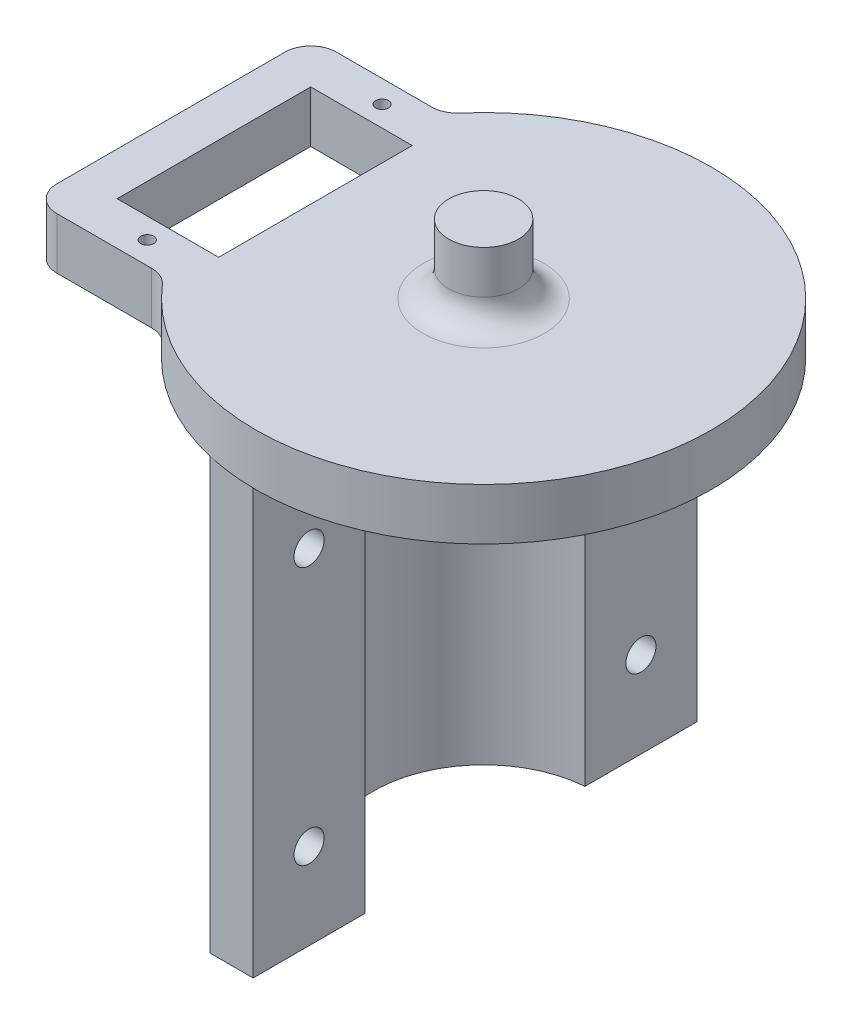
ISO-10303-21;
HEADER;
FILE_DESCRIPTION(('STEP AP214'),'2;1');
FILE_NAME('part.step','',(''),(''),'','','');
FILE_SCHEMA(('AUTOMOTIVE_DESIGN { 1 0 10303 214 1 1 1 1 }'));
ENDSEC;
DATA;
#1=APPLICATION_CONTEXT('core data for automotive mechanical design processes');
#2=APPLICATION_PROTOCOL_DEFINITION('international standard','automotive_design',2000,#1);
#3=PRODUCT_CONTEXT('',#1,'mechanical');
#4=PRODUCT('Part','Part','',(#3));
#5=PRODUCT_RELATED_PRODUCT_CATEGORY('part','',(#4));
#6=PRODUCT_DEFINITION_FORMATION('','',#4);
#7=PRODUCT_DEFINITION_CONTEXT('part definition',#1,'design');
#8=PRODUCT_DEFINITION('design','',#6,#7);
#9=PRODUCT_DEFINITION_SHAPE('','',#8);
#10=(LENGTH_UNIT() NAMED_UNIT(*) SI_UNIT(.MILLI.,.METRE.));
#11=(NAMED_UNIT(*) PLANE_ANGLE_UNIT() SI_UNIT($,.RADIAN.));
#12=(NAMED_UNIT(*) SI_UNIT($,.STERADIAN.) SOLID_ANGLE_UNIT());
#13=UNCERTAINTY_MEASURE_WITH_UNIT(LENGTH_MEASURE(1.E-05),#10,'distance_accuracy_value','');
#14=(GEOMETRIC_REPRESENTATION_CONTEXT(3) GLOBAL_UNCERTAINTY_ASSIGNED_CONTEXT((#13)) GLOBAL_UNIT_ASSIGNED_CONTEXT((#10,
#11,#12)) REPRESENTATION_CONTEXT('',''));
#15=CARTESIAN_POINT('',(0.,0.,0.));
#16=DIRECTION('',(0.,0.,1.));
#17=DIRECTION('',(1.,0.,0.));
#18=AXIS2_PLACEMENT_3D('',#15,#16,#17);
#19=CARTESIAN_POINT('',(-1.,-50.,25.7848331835619));
#20=DIRECTION('',(0.,0.,-1.));
#21=DIRECTION('',(-1.,0.,0.));
#22=AXIS2_PLACEMENT_3D('',#19,#20,#21);
#23=PLANE('',#22);
#24=DIRECTION('',(-1.,0.,0.));
#25=VECTOR('',#24,1.);
#26=CARTESIAN_POINT('',(-1.,0.,25.7848331835619));
#27=LINE('',#26,#25);
#28=CARTESIAN_POINT('',(-1.,0.,25.7848331835619));
#29=VERTEX_POINT('',#28);
#30=CARTESIAN_POINT('',(-6.,0.,25.7848331835619));
#31=VERTEX_POINT('',#30);
#32=EDGE_CURVE('E352',#29,#31,#27,.T.);
#33=ORIENTED_EDGE('',*,*,#32,.T.);
#34=DIRECTION('',(0.,1.,0.));
#35=VECTOR('',#34,1.);
#36=CARTESIAN_POINT('',(-6.,-50.,25.7848331835619));
#37=LINE('',#36,#35);
#38=CARTESIAN_POINT('',(-6.,-50.,25.7848331835619));
#39=VERTEX_POINT('',#38);
#40=EDGE_CURVE('E435',#39,#31,#37,.T.);
#41=ORIENTED_EDGE('',*,*,#40,.F.);
#42=DIRECTION('',(-1.,0.,0.));
#43=VECTOR('',#42,1.);
#44=CARTESIAN_POINT('',(-1.,-50.,25.7848331835619));
#45=LINE('',#44,#43);
#46=CARTESIAN_POINT('',(-1.,-50.,25.7848331835619));
#47=VERTEX_POINT('',#46);
#48=EDGE_CURVE('E353',#47,#39,#45,.T.);
#49=ORIENTED_EDGE('',*,*,#48,.F.);
#50=DIRECTION('',(0.,1.,0.));
#51=VECTOR('',#50,1.);
#52=CARTESIAN_POINT('',(-1.,-50.,25.7848331835619));
#53=LINE('',#52,#51);
#54=EDGE_CURVE('E377',#47,#29,#53,.T.);
#55=ORIENTED_EDGE('',*,*,#54,.T.);
#56=EDGE_LOOP('',(#33,#41,#49,#55));
#57=FACE_BOUND('',#56,.T.);
#58=ADVANCED_FACE('F44',(#57),#23,.F.);
#59=CARTESIAN_POINT('',(-6.,-50.,25.7848331835619));
#60=DIRECTION('',(1.,0.,0.));
#61=DIRECTION('',(0.,0.,-1.));
#62=AXIS2_PLACEMENT_3D('',#59,#60,#61);
#63=PLANE('',#62);
#64=CARTESIAN_POINT('',(-6.,-40.,19.2853936956035));
#65=DIRECTION('',(1.,0.,0.));
#66=DIRECTION('',(0.,0.,-1.));
#67=AXIS2_PLACEMENT_3D('',#64,#65,#66);
#68=CIRCLE('',#67,1.75);
#69=CARTESIAN_POINT('',(-6.,-40.,17.5353936956035));
#70=VERTEX_POINT('',#69);
#71=EDGE_CURVE('E340',#70,#70,#68,.T.);
#72=ORIENTED_EDGE('',*,*,#71,.T.);
#73=EDGE_LOOP('',(#72));
#74=FACE_BOUND('',#73,.T.);
#75=CARTESIAN_POINT('',(-6.,-10.,19.2853936956035));
#76=DIRECTION('',(1.,0.,0.));
#77=DIRECTION('',(0.,0.,-1.));
#78=AXIS2_PLACEMENT_3D('',#75,#76,#77);
#79=CIRCLE('',#78,1.75);
#80=CARTESIAN_POINT('',(-6.,-10.,17.5353936956035));
#81=VERTEX_POINT('',#80);
#82=EDGE_CURVE('E336',#81,#81,#79,.T.);
#83=ORIENTED_EDGE('',*,*,#82,.T.);
#84=EDGE_LOOP('',(#83));
#85=FACE_BOUND('',#84,.T.);
#86=DIRECTION('',(0.,0.,-1.));
#87=VECTOR('',#86,1.);
#88=CARTESIAN_POINT('',(-6.,0.,25.7848331835619));
#89=LINE('',#88,#87);
#90=CARTESIAN_POINT('',(-5.99999999999999,0.,16.7848331835619));
#91=VERTEX_POINT('',#90);
#92=EDGE_CURVE('E381',#31,#91,#89,.T.);
#93=ORIENTED_EDGE('',*,*,#92,.T.);
#94=DIRECTION('',(0.,1.,0.));
#95=VECTOR('',#94,1.);
#96=CARTESIAN_POINT('',(-5.99999999999999,-50.,16.7848331835619));
#97=LINE('',#96,#95);
#98=CARTESIAN_POINT('',(-5.99999999999999,-50.,16.7848331835619));
#99=VERTEX_POINT('',#98);
#100=EDGE_CURVE('E431',#99,#91,#97,.T.);
#101=ORIENTED_EDGE('',*,*,#100,.F.);
#102=DIRECTION('',(0.,0.,-1.));
#103=VECTOR('',#102,1.);
#104=CARTESIAN_POINT('',(-6.,-50.,25.7848331835619));
#105=LINE('',#104,#103);
#106=EDGE_CURVE('E356',#39,#99,#105,.T.);
#107=ORIENTED_EDGE('',*,*,#106,.F.);
#108=ORIENTED_EDGE('',*,*,#40,.T.);
#109=EDGE_LOOP('',(#93,#101,#107,#108));
#110=FACE_BOUND('',#109,.T.);
#111=ADVANCED_FACE('F456',(#74,#85,#110),#63,.F.);
#112=CARTESIAN_POINT('',(0.,-50.,0.));
#113=DIRECTION('',(0.,1.,0.));
#114=DIRECTION('',(0.,0.,1.));
#115=AXIS2_PLACEMENT_3D('',#112,#113,#114);
#116=CYLINDRICAL_SURFACE('',#115,17.825);
#117=CARTESIAN_POINT('',(0.,0.,0.));
#118=DIRECTION('',(0.,-1.,0.));
#119=DIRECTION('',(0.,0.,-1.));
#120=AXIS2_PLACEMENT_3D('',#117,#118,#119);
#121=CIRCLE('',#120,17.825);
#122=CARTESIAN_POINT('',(-6.,0.,-16.7848331835619));
#123=VERTEX_POINT('',#122);
#124=EDGE_CURVE('E385',#91,#123,#121,.T.);
#125=ORIENTED_EDGE('',*,*,#124,.T.);
#126=DIRECTION('',(0.,1.,0.));
#127=VECTOR('',#126,1.);
#128=CARTESIAN_POINT('',(-6.,-50.,-16.7848331835619));
#129=LINE('',#128,#127);
#130=CARTESIAN_POINT('',(-6.,-50.,-16.7848331835619));
#131=VERTEX_POINT('',#130);
#132=EDGE_CURVE('E427',#131,#123,#129,.T.);
#133=ORIENTED_EDGE('',*,*,#132,.F.);
#134=CARTESIAN_POINT('',(0.,-50.,0.));
#135=DIRECTION('',(0.,-1.,0.));
#136=DIRECTION('',(0.,0.,-1.));
#137=AXIS2_PLACEMENT_3D('',#134,#135,#136);
#138=CIRCLE('',#137,17.825);
#139=EDGE_CURVE('E360',#99,#131,#138,.T.);
#140=ORIENTED_EDGE('',*,*,#139,.F.);
#141=ORIENTED_EDGE('',*,*,#100,.T.);
#142=EDGE_LOOP('',(#125,#133,#140,#141));
#143=FACE_BOUND('',#142,.T.);
#144=ADVANCED_FACE('F462',(#143),#116,.T.);
#145=CARTESIAN_POINT('',(-6.,-50.,-16.7848331835619));
#146=DIRECTION('',(1.,0.,0.));
#147=DIRECTION('',(0.,0.,-1.));
#148=AXIS2_PLACEMENT_3D('',#145,#146,#147);
#149=PLANE('',#148);
#150=CARTESIAN_POINT('',(-6.,-10.,-19.2853936956035));
#151=DIRECTION('',(1.,0.,0.));
#152=DIRECTION('',(0.,0.,-1.));
#153=AXIS2_PLACEMENT_3D('',#150,#151,#152);
#154=CIRCLE('',#153,1.75000000000001);
#155=CARTESIAN_POINT('',(-6.,-10.,-21.0353936956035));
#156=VERTEX_POINT('',#155);
#157=EDGE_CURVE('E348',#156,#156,#154,.T.);
#158=ORIENTED_EDGE('',*,*,#157,.T.);
#159=EDGE_LOOP('',(#158));
#160=FACE_BOUND('',#159,.T.);
#161=CARTESIAN_POINT('',(-6.,-40.,-19.2853936956035));
#162=DIRECTION('',(1.,0.,0.));
#163=DIRECTION('',(0.,0.,-1.));
#164=AXIS2_PLACEMENT_3D('',#161,#162,#163);
#165=CIRCLE('',#164,1.75000000000001);
#166=CARTESIAN_POINT('',(-6.,-40.,-21.0353936956036));
#167=VERTEX_POINT('',#166);
#168=EDGE_CURVE('E344',#167,#167,#165,.T.);
#169=ORIENTED_EDGE('',*,*,#168,.T.);
#170=EDGE_LOOP('',(#169));
#171=FACE_BOUND('',#170,.T.);
#172=DIRECTION('',(0.,0.,-1.));
#173=VECTOR('',#172,1.);
#174=CARTESIAN_POINT('',(-6.,0.,-16.7848331835619));
#175=LINE('',#174,#173);
#176=CARTESIAN_POINT('',(-6.,0.,-25.7848331835619));
#177=VERTEX_POINT('',#176);
#178=EDGE_CURVE('E389',#123,#177,#175,.T.);
#179=ORIENTED_EDGE('',*,*,#178,.T.);
#180=DIRECTION('',(0.,1.,0.));
#181=VECTOR('',#180,1.);
#182=CARTESIAN_POINT('',(-6.,-50.,-25.7848331835619));
#183=LINE('',#182,#181);
#184=CARTESIAN_POINT('',(-6.,-50.,-25.7848331835619));
#185=VERTEX_POINT('',#184);
#186=EDGE_CURVE('E423',#185,#177,#183,.T.);
#187=ORIENTED_EDGE('',*,*,#186,.F.);
#188=DIRECTION('',(0.,0.,-1.));
#189=VECTOR('',#188,1.);
#190=CARTESIAN_POINT('',(-6.,-50.,-16.7848331835619));
#191=LINE('',#190,#189);
#192=EDGE_CURVE('E363',#131,#185,#191,.T.);
#193=ORIENTED_EDGE('',*,*,#192,.F.);
#194=ORIENTED_EDGE('',*,*,#132,.T.);
#195=EDGE_LOOP('',(#179,#187,#193,#194));
#196=FACE_BOUND('',#195,.T.);
#197=ADVANCED_FACE('F468',(#160,#171,#196),#149,.F.);
#198=CARTESIAN_POINT('',(-6.,-50.,-25.7848331835619));
#199=DIRECTION('',(0.,0.,1.));
#200=DIRECTION('',(1.,0.,0.));
#201=AXIS2_PLACEMENT_3D('',#198,#199,#200);
#202=PLANE('',#201);
#203=DIRECTION('',(1.,0.,0.));
#204=VECTOR('',#203,1.);
#205=CARTESIAN_POINT('',(-6.,0.,-25.7848331835619));
#206=LINE('',#205,#204);
#207=CARTESIAN_POINT('',(-1.,0.,-25.7848331835619));
#208=VERTEX_POINT('',#207);
#209=EDGE_CURVE('E393',#177,#208,#206,.T.);
#210=ORIENTED_EDGE('',*,*,#209,.T.);
#211=DIRECTION('',(0.,1.,0.));
#212=VECTOR('',#211,1.);
#213=CARTESIAN_POINT('',(-1.,-50.,-25.7848331835619));
#214=LINE('',#213,#212);
#215=CARTESIAN_POINT('',(-1.,-50.,-25.7848331835619));
#216=VERTEX_POINT('',#215);
#217=EDGE_CURVE('E419',#216,#208,#214,.T.);
#218=ORIENTED_EDGE('',*,*,#217,.F.);
#219=DIRECTION('',(1.,0.,0.));
#220=VECTOR('',#219,1.);
#221=CARTESIAN_POINT('',(-6.,-50.,-25.7848331835619));
#222=LINE('',#221,#220);
#223=EDGE_CURVE('E366',#185,#216,#222,.T.);
#224=ORIENTED_EDGE('',*,*,#223,.F.);
#225=ORIENTED_EDGE('',*,*,#186,.T.);
#226=EDGE_LOOP('',(#210,#218,#224,#225));
#227=FACE_BOUND('',#226,.T.);
#228=ADVANCED_FACE('F472',(#227),#202,.F.);
#229=CARTESIAN_POINT('',(-1.,-50.,-25.7848331835619));
#230=DIRECTION('',(-1.,0.,0.));
#231=DIRECTION('',(0.,0.,1.));
#232=AXIS2_PLACEMENT_3D('',#229,#230,#231);
#233=PLANE('',#232);
#234=CARTESIAN_POINT('',(-1.,-10.,-19.2853936956035));
#235=DIRECTION('',(1.,0.,0.));
#236=DIRECTION('',(0.,0.,1.));
#237=AXIS2_PLACEMENT_3D('',#234,#235,#236);
#238=CIRCLE('',#237,1.75000000000001);
#239=CARTESIAN_POINT('',(-1.,-10.,-17.5353936956035));
#240=VERTEX_POINT('',#239);
#241=EDGE_CURVE('E320',#240,#240,#238,.T.);
#242=ORIENTED_EDGE('',*,*,#241,.F.);
#243=EDGE_LOOP('',(#242));
#244=FACE_BOUND('',#243,.T.);
#245=CARTESIAN_POINT('',(-1.,-40.,-19.2853936956035));
#246=DIRECTION('',(1.,0.,0.));
#247=DIRECTION('',(0.,0.,-1.));
#248=AXIS2_PLACEMENT_3D('',#245,#246,#247);
#249=CIRCLE('',#248,1.75000000000001);
#250=CARTESIAN_POINT('',(-1.,-40.,-21.0353936956036));
#251=VERTEX_POINT('',#250);
#252=EDGE_CURVE('E326',#251,#251,#249,.T.);
#253=ORIENTED_EDGE('',*,*,#252,.F.);
#254=EDGE_LOOP('',(#253));
#255=FACE_BOUND('',#254,.T.);
#256=DIRECTION('',(0.,0.,1.));
#257=VECTOR('',#256,1.);
#258=CARTESIAN_POINT('',(-1.,0.,-25.7848331835619));
#259=LINE('',#258,#257);
#260=CARTESIAN_POINT('',(-1.00000000000001,0.,-12.7859542076452));
#261=VERTEX_POINT('',#260);
#262=EDGE_CURVE('E397',#208,#261,#259,.T.);
#263=ORIENTED_EDGE('',*,*,#262,.T.);
#264=DIRECTION('',(0.,1.,0.));
#265=VECTOR('',#264,1.);
#266=CARTESIAN_POINT('',(-1.00000000000001,-50.,-12.7859542076452));
#267=LINE('',#266,#265);
#268=CARTESIAN_POINT('',(-1.00000000000001,-50.,-12.7859542076452));
#269=VERTEX_POINT('',#268);
#270=EDGE_CURVE('E415',#269,#261,#267,.T.);
#271=ORIENTED_EDGE('',*,*,#270,.F.);
#272=DIRECTION('',(0.,0.,1.));
#273=VECTOR('',#272,1.);
#274=CARTESIAN_POINT('',(-1.,-50.,-25.7848331835619));
#275=LINE('',#274,#273);
#276=EDGE_CURVE('E369',#216,#269,#275,.T.);
#277=ORIENTED_EDGE('',*,*,#276,.F.);
#278=ORIENTED_EDGE('',*,*,#217,.T.);
#279=EDGE_LOOP('',(#263,#271,#277,#278));
#280=FACE_BOUND('',#279,.T.);
#281=ADVANCED_FACE('F476',(#244,#255,#280),#233,.F.);
#282=CARTESIAN_POINT('',(0.,-50.,0.));
#283=DIRECTION('',(0.,1.,0.));
#284=DIRECTION('',(0.,0.,1.));
#285=AXIS2_PLACEMENT_3D('',#282,#283,#284);
#286=CYLINDRICAL_SURFACE('',#285,12.825);
#287=CARTESIAN_POINT('',(0.,0.,0.));
#288=DIRECTION('',(0.,1.,0.));
#289=DIRECTION('',(0.,0.,-1.));
#290=AXIS2_PLACEMENT_3D('',#287,#288,#289);
#291=CIRCLE('',#290,12.825);
#292=CARTESIAN_POINT('',(-1.,0.,12.7859542076452));
#293=VERTEX_POINT('',#292);
#294=EDGE_CURVE('E401',#261,#293,#291,.T.);
#295=ORIENTED_EDGE('',*,*,#294,.T.);
#296=DIRECTION('',(0.,1.,0.));
#297=VECTOR('',#296,1.);
#298=CARTESIAN_POINT('',(-1.,-50.,12.7859542076452));
#299=LINE('',#298,#297);
#300=CARTESIAN_POINT('',(-1.,-50.,12.7859542076452));
#301=VERTEX_POINT('',#300);
#302=EDGE_CURVE('E411',#301,#293,#299,.T.);
#303=ORIENTED_EDGE('',*,*,#302,.F.);
#304=CARTESIAN_POINT('',(0.,-50.,0.));
#305=DIRECTION('',(0.,1.,0.));
#306=DIRECTION('',(0.,0.,-1.));
#307=AXIS2_PLACEMENT_3D('',#304,#305,#306);
#308=CIRCLE('',#307,12.825);
#309=EDGE_CURVE('E372',#269,#301,#308,.T.);
#310=ORIENTED_EDGE('',*,*,#309,.F.);
#311=ORIENTED_EDGE('',*,*,#270,.T.);
#312=EDGE_LOOP('',(#295,#303,#310,#311));
#313=FACE_BOUND('',#312,.T.);
#314=ADVANCED_FACE('F480',(#313),#286,.F.);
#315=CARTESIAN_POINT('',(-1.,-50.,25.7848331835619));
#316=DIRECTION('',(-1.,0.,0.));
#317=DIRECTION('',(0.,0.,1.));
#318=AXIS2_PLACEMENT_3D('',#315,#316,#317);
#319=PLANE('',#318);
#320=CARTESIAN_POINT('',(-1.,-40.,19.2853936956035));
#321=DIRECTION('',(1.,0.,0.));
#322=DIRECTION('',(0.,0.,1.));
#323=AXIS2_PLACEMENT_3D('',#320,#321,#322);
#324=CIRCLE('',#323,1.75);
#325=CARTESIAN_POINT('',(-1.,-40.,21.0353936956035));
#326=VERTEX_POINT('',#325);
#327=EDGE_CURVE('E321',#326,#326,#324,.T.);
#328=ORIENTED_EDGE('',*,*,#327,.F.);
#329=EDGE_LOOP('',(#328));
#330=FACE_BOUND('',#329,.T.);
#331=CARTESIAN_POINT('',(-1.,-10.,19.2853936956035));
#332=DIRECTION('',(1.,0.,0.));
#333=DIRECTION('',(0.,0.,-1.));
#334=AXIS2_PLACEMENT_3D('',#331,#332,#333);
#335=CIRCLE('',#334,1.75);
#336=CARTESIAN_POINT('',(-1.,-10.,17.5353936956035));
#337=VERTEX_POINT('',#336);
#338=EDGE_CURVE('E325',#337,#337,#335,.T.);
#339=ORIENTED_EDGE('',*,*,#338,.F.);
#340=EDGE_LOOP('',(#339));
#341=FACE_BOUND('',#340,.T.);
#342=DIRECTION('',(0.,0.,1.));
#343=VECTOR('',#342,1.);
#344=CARTESIAN_POINT('',(-1.,0.,25.7848331835619));
#345=LINE('',#344,#343);
#346=EDGE_CURVE('E357',#293,#29,#345,.T.);
#347=ORIENTED_EDGE('',*,*,#346,.T.);
#348=ORIENTED_EDGE('',*,*,#54,.F.);
#349=DIRECTION('',(0.,0.,1.));
#350=VECTOR('',#349,1.);
#351=CARTESIAN_POINT('',(-1.,-50.,25.7848331835619));
#352=LINE('',#351,#350);
#353=EDGE_CURVE('E61',#301,#47,#352,.T.);
#354=ORIENTED_EDGE('',*,*,#353,.F.);
#355=ORIENTED_EDGE('',*,*,#302,.T.);
#356=EDGE_LOOP('',(#347,#348,#354,#355));
#357=FACE_BOUND('',#356,.T.);
#358=ADVANCED_FACE('F484',(#330,#341,#357),#319,.F.);
#359=CARTESIAN_POINT('',(0.,-50.,0.));
#360=DIRECTION('',(0.,-1.,0.));
#361=DIRECTION('',(0.,0.,-1.));
#362=AXIS2_PLACEMENT_3D('',#359,#360,#361);
#363=PLANE('',#362);
#364=ORIENTED_EDGE('',*,*,#48,.T.);
#365=ORIENTED_EDGE('',*,*,#106,.T.);
#366=ORIENTED_EDGE('',*,*,#139,.T.);
#367=ORIENTED_EDGE('',*,*,#192,.T.);
#368=ORIENTED_EDGE('',*,*,#223,.T.);
#369=ORIENTED_EDGE('',*,*,#276,.T.);
#370=ORIENTED_EDGE('',*,*,#309,.T.);
#371=ORIENTED_EDGE('',*,*,#353,.T.);
#372=EDGE_LOOP('',(#364,#365,#366,#367,#368,#369,#370,#371));
#373=FACE_BOUND('',#372,.T.);
#374=ADVANCED_FACE('F488',(#373),#363,.T.);
#375=CARTESIAN_POINT('',(-17.825,-10.,19.2853936956035));
#376=DIRECTION('',(1.,0.,0.));
#377=DIRECTION('',(0.,0.,-1.));
#378=AXIS2_PLACEMENT_3D('',#375,#376,#377);
#379=CYLINDRICAL_SURFACE('',#378,1.75);
#380=ORIENTED_EDGE('',*,*,#338,.T.);
#381=EDGE_LOOP('',(#380));
#382=FACE_BOUND('',#381,.T.);
#383=ORIENTED_EDGE('',*,*,#82,.F.);
#384=EDGE_LOOP('',(#383));
#385=FACE_BOUND('',#384,.T.);
#386=ADVANCED_FACE('F492',(#382,#385),#379,.F.);
#387=CARTESIAN_POINT('',(-17.825,-40.,19.2853936956035));
#388=DIRECTION('',(1.,0.,0.));
#389=DIRECTION('',(0.,0.,-1.));
#390=AXIS2_PLACEMENT_3D('',#387,#388,#389);
#391=CYLINDRICAL_SURFACE('',#390,1.75);
#392=ORIENTED_EDGE('',*,*,#327,.T.);
#393=EDGE_LOOP('',(#392));
#394=FACE_BOUND('',#393,.T.);
#395=ORIENTED_EDGE('',*,*,#71,.F.);
#396=EDGE_LOOP('',(#395));
#397=FACE_BOUND('',#396,.T.);
#398=ADVANCED_FACE('F495',(#394,#397),#391,.F.);
#399=CARTESIAN_POINT('',(-17.825,-40.,-19.2853936956035));
#400=DIRECTION('',(1.,0.,0.));
#401=DIRECTION('',(0.,0.,-1.));
#402=AXIS2_PLACEMENT_3D('',#399,#400,#401);
#403=CYLINDRICAL_SURFACE('',#402,1.75000000000001);
#404=ORIENTED_EDGE('',*,*,#252,.T.);
#405=EDGE_LOOP('',(#404));
#406=FACE_BOUND('',#405,.T.);
#407=ORIENTED_EDGE('',*,*,#168,.F.);
#408=EDGE_LOOP('',(#407));
#409=FACE_BOUND('',#408,.T.);
#410=ADVANCED_FACE('F500',(#406,#409),#403,.F.);
#411=CARTESIAN_POINT('',(-17.825,-10.,-19.2853936956035));
#412=DIRECTION('',(1.,0.,0.));
#413=DIRECTION('',(0.,0.,-1.));
#414=AXIS2_PLACEMENT_3D('',#411,#412,#413);
#415=CYLINDRICAL_SURFACE('',#414,1.75000000000001);
#416=ORIENTED_EDGE('',*,*,#241,.T.);
#417=EDGE_LOOP('',(#416));
#418=FACE_BOUND('',#417,.T.);
#419=ORIENTED_EDGE('',*,*,#157,.F.);
#420=EDGE_LOOP('',(#419));
#421=FACE_BOUND('',#420,.T.);
#422=ADVANCED_FACE('F497',(#418,#421),#415,.F.);
#423=CARTESIAN_POINT('',(-22.3189922807748,0.,-19.25));
#424=DIRECTION('',(0.,1.,0.));
#425=DIRECTION('',(0.,0.,1.));
#426=AXIS2_PLACEMENT_3D('',#423,#424,#425);
#427=PLANE('',#426);
#428=ORIENTED_EDGE('',*,*,#32,.F.);
#429=ORIENTED_EDGE('',*,*,#346,.F.);
#430=ORIENTED_EDGE('',*,*,#294,.F.);
#431=ORIENTED_EDGE('',*,*,#262,.F.);
#432=ORIENTED_EDGE('',*,*,#209,.F.);
#433=CARTESIAN_POINT('',(0.,0.,0.));
#434=DIRECTION('',(0.,1.,0.));
#435=DIRECTION('',(0.,0.,1.));
#436=AXIS2_PLACEMENT_3D('',#433,#434,#435);
#437=CIRCLE('',#436,26.4737156875289);
#438=EDGE_CURVE('E288',#31,#177,#437,.T.);
#439=ORIENTED_EDGE('',*,*,#438,.F.);
#440=EDGE_LOOP('',(#428,#429,#430,#431,#432,#439));
#441=FACE_BOUND('',#440,.T.);
#442=ADVANCED_FACE('F499',(#441),#427,.F.);
#443=CARTESIAN_POINT('',(-25.443614130072,0.,13.65));
#444=DIRECTION('',(0.,1.,0.));
#445=DIRECTION('',(0.,0.,1.));
#446=AXIS2_PLACEMENT_3D('',#443,#444,#445);
#447=CIRCLE('',#446,0.749999999999998);
#448=CARTESIAN_POINT('',(-25.443614130072,0.,14.4));
#449=VERTEX_POINT('',#448);
#450=EDGE_CURVE('E766',#449,#449,#447,.T.);
#451=ORIENTED_EDGE('',*,*,#450,.T.);
#452=EDGE_LOOP('',(#451));
#453=FACE_BOUND('',#452,.T.);
#454=CARTESIAN_POINT('',(-25.443614130072,0.,-13.65));
#455=DIRECTION('',(0.,1.,0.));
#456=DIRECTION('',(0.,0.,1.));
#457=AXIS2_PLACEMENT_3D('',#454,#455,#456);
#458=CIRCLE('',#457,0.749999999999998);
#459=CARTESIAN_POINT('',(-25.443614130072,0.,-12.9));
#460=VERTEX_POINT('',#459);
#461=EDGE_CURVE('E770',#460,#460,#458,.T.);
#462=ORIENTED_EDGE('',*,*,#461,.T.);
#463=EDGE_LOOP('',(#462));
#464=FACE_BOUND('',#463,.T.);
#465=DIRECTION('',(0.,0.,1.));
#466=VECTOR('',#465,1.);
#467=CARTESIAN_POINT('',(-31.343614130072,0.,11.25));
#468=LINE('',#467,#466);
#469=CARTESIAN_POINT('',(-31.343614130072,0.,-11.25));
#470=VERTEX_POINT('',#469);
#471=CARTESIAN_POINT('',(-31.343614130072,0.,11.25));
#472=VERTEX_POINT('',#471);
#473=EDGE_CURVE('E216',#470,#472,#468,.T.);
#474=ORIENTED_EDGE('',*,*,#473,.T.);
#475=DIRECTION('',(1.,0.,0.));
#476=VECTOR('',#475,1.);
#477=CARTESIAN_POINT('',(-31.343614130072,0.,11.25));
#478=LINE('',#477,#476);
#479=CARTESIAN_POINT('',(-19.543614130072,0.,11.25));
#480=VERTEX_POINT('',#479);
#481=EDGE_CURVE('E197',#472,#480,#478,.T.);
#482=ORIENTED_EDGE('',*,*,#481,.T.);
#483=DIRECTION('',(0.,0.,-1.));
#484=VECTOR('',#483,1.);
#485=CARTESIAN_POINT('',(-19.543614130072,0.,11.25));
#486=LINE('',#485,#484);
#487=CARTESIAN_POINT('',(-19.543614130072,0.,-11.25));
#488=VERTEX_POINT('',#487);
#489=EDGE_CURVE('E222',#480,#488,#486,.T.);
#490=ORIENTED_EDGE('',*,*,#489,.T.);
#491=DIRECTION('',(-1.,0.,0.));
#492=VECTOR('',#491,1.);
#493=CARTESIAN_POINT('',(-31.343614130072,0.,-11.25));
#494=LINE('',#493,#492);
#495=EDGE_CURVE('E191',#488,#470,#494,.T.);
#496=ORIENTED_EDGE('',*,*,#495,.T.);
#497=EDGE_LOOP('',(#474,#482,#490,#496));
#498=FACE_BOUND('',#497,.T.);
#499=ORIENTED_EDGE('',*,*,#178,.F.);
#500=ORIENTED_EDGE('',*,*,#124,.F.);
#501=ORIENTED_EDGE('',*,*,#92,.F.);
#502=CARTESIAN_POINT('',(-20.0472401355014,0.,17.290627092551));
#503=VERTEX_POINT('',#502);
#504=EDGE_CURVE('E241',#503,#31,#437,.T.);
#505=ORIENTED_EDGE('',*,*,#504,.F.);
#506=CARTESIAN_POINT('',(-22.3189922807748,0.,19.25));
#507=DIRECTION('',(0.,-1.,0.));
#508=DIRECTION('',(0.,0.,-1.));
#509=AXIS2_PLACEMENT_3D('',#506,#507,#508);
#510=CIRCLE('',#509,3.);
#511=CARTESIAN_POINT('',(-22.3189922807748,0.,16.25));
#512=VERTEX_POINT('',#511);
#513=EDGE_CURVE('E281',#512,#503,#510,.T.);
#514=ORIENTED_EDGE('',*,*,#513,.F.);
#515=DIRECTION('',(1.,0.,0.));
#516=VECTOR('',#515,1.);
#517=CARTESIAN_POINT('',(-33.343614130072,0.,16.25));
#518=LINE('',#517,#516);
#519=CARTESIAN_POINT('',(-33.343614130072,0.,16.25));
#520=VERTEX_POINT('',#519);
#521=EDGE_CURVE('E278',#520,#512,#518,.T.);
#522=ORIENTED_EDGE('',*,*,#521,.F.);
#523=CARTESIAN_POINT('',(-33.343614130072,0.,13.25));
#524=DIRECTION('',(0.,1.,0.));
#525=DIRECTION('',(0.,0.,-1.));
#526=AXIS2_PLACEMENT_3D('',#523,#524,#525);
#527=CIRCLE('',#526,3.);
#528=CARTESIAN_POINT('',(-36.343614130072,0.,13.25));
#529=VERTEX_POINT('',#528);
#530=EDGE_CURVE('E275',#529,#520,#527,.T.);
#531=ORIENTED_EDGE('',*,*,#530,.F.);
#532=DIRECTION('',(0.,0.,1.));
#533=VECTOR('',#532,1.);
#534=CARTESIAN_POINT('',(-36.343614130072,0.,13.25));
#535=LINE('',#534,#533);
#536=CARTESIAN_POINT('',(-36.343614130072,0.,-13.25));
#537=VERTEX_POINT('',#536);
#538=EDGE_CURVE('E272',#537,#529,#535,.T.);
#539=ORIENTED_EDGE('',*,*,#538,.F.);
#540=CARTESIAN_POINT('',(-33.343614130072,0.,-13.25));
#541=DIRECTION('',(0.,1.,0.));
#542=DIRECTION('',(0.,0.,-1.));
#543=AXIS2_PLACEMENT_3D('',#540,#541,#542);
#544=CIRCLE('',#543,3.);
#545=CARTESIAN_POINT('',(-33.343614130072,0.,-16.25));
#546=VERTEX_POINT('',#545);
#547=EDGE_CURVE('E269',#546,#537,#544,.T.);
#548=ORIENTED_EDGE('',*,*,#547,.F.);
#549=DIRECTION('',(-1.,0.,0.));
#550=VECTOR('',#549,1.);
#551=CARTESIAN_POINT('',(-33.343614130072,0.,-16.25));
#552=LINE('',#551,#550);
#553=CARTESIAN_POINT('',(-22.3189922807748,0.,-16.25));
#554=VERTEX_POINT('',#553);
#555=EDGE_CURVE('E266',#554,#546,#552,.T.);
#556=ORIENTED_EDGE('',*,*,#555,.F.);
#557=CARTESIAN_POINT('',(-22.3189922807748,0.,-19.25));
#558=DIRECTION('',(0.,-1.,0.));
#559=DIRECTION('',(0.,0.,1.));
#560=AXIS2_PLACEMENT_3D('',#557,#558,#559);
#561=CIRCLE('',#560,3.);
#562=CARTESIAN_POINT('',(-20.0472401355014,0.,-17.290627092551));
#563=VERTEX_POINT('',#562);
#564=EDGE_CURVE('E199',#563,#554,#561,.T.);
#565=ORIENTED_EDGE('',*,*,#564,.F.);
#566=EDGE_CURVE('E284',#177,#563,#437,.T.);
#567=ORIENTED_EDGE('',*,*,#566,.F.);
#568=EDGE_LOOP('',(#499,#500,#501,#505,#514,#522,#531,#539,#548,#556,#565,#567));
#569=FACE_BOUND('',#568,.T.);
#570=ADVANCED_FACE('F542',(#453,#464,#498,#569),#427,.F.);
#571=CARTESIAN_POINT('',(-22.3189922807748,6.,-19.25));
#572=DIRECTION('',(0.,1.,0.));
#573=DIRECTION('',(0.,0.,1.));
#574=AXIS2_PLACEMENT_3D('',#571,#572,#573);
#575=PLANE('',#574);
#576=CARTESIAN_POINT('',(0.,6.,0.));
#577=DIRECTION('',(0.,1.,0.));
#578=DIRECTION('',(0.,0.,1.));
#579=AXIS2_PLACEMENT_3D('',#576,#577,#578);
#580=CIRCLE('',#579,7.05);
#581=CARTESIAN_POINT('',(0.,6.,7.05));
#582=VERTEX_POINT('',#581);
#583=EDGE_CURVE('E11',#582,#582,#580,.F.);
#584=ORIENTED_EDGE('',*,*,#583,.T.);
#585=EDGE_LOOP('',(#584));
#586=FACE_BOUND('',#585,.T.);
#587=CARTESIAN_POINT('',(-25.443614130072,6.,-13.65));
#588=DIRECTION('',(0.,1.,0.));
#589=DIRECTION('',(0.,0.,1.));
#590=AXIS2_PLACEMENT_3D('',#587,#588,#589);
#591=CIRCLE('',#590,0.749999999999998);
#592=CARTESIAN_POINT('',(-25.443614130072,6.,-12.9));
#593=VERTEX_POINT('',#592);
#594=EDGE_CURVE('E219',#593,#593,#591,.T.);
#595=ORIENTED_EDGE('',*,*,#594,.F.);
#596=EDGE_LOOP('',(#595));
#597=FACE_BOUND('',#596,.T.);
#598=CARTESIAN_POINT('',(-22.3189922807748,6.,-19.25));
#599=DIRECTION('',(0.,-1.,0.));
#600=DIRECTION('',(0.,0.,1.));
#601=AXIS2_PLACEMENT_3D('',#598,#599,#600);
#602=CIRCLE('',#601,3.);
#603=CARTESIAN_POINT('',(-20.0472401355014,6.,-17.290627092551));
#604=VERTEX_POINT('',#603);
#605=CARTESIAN_POINT('',(-22.3189922807748,6.,-16.25));
#606=VERTEX_POINT('',#605);
#607=EDGE_CURVE('E236',#604,#606,#602,.T.);
#608=ORIENTED_EDGE('',*,*,#607,.T.);
#609=DIRECTION('',(-1.,0.,0.));
#610=VECTOR('',#609,1.);
#611=CARTESIAN_POINT('',(-33.343614130072,6.,-16.25));
#612=LINE('',#611,#610);
#613=CARTESIAN_POINT('',(-33.343614130072,6.,-16.25));
#614=VERTEX_POINT('',#613);
#615=EDGE_CURVE('E240',#606,#614,#612,.T.);
#616=ORIENTED_EDGE('',*,*,#615,.T.);
#617=CARTESIAN_POINT('',(-33.343614130072,6.,-13.25));
#618=DIRECTION('',(0.,1.,0.));
#619=DIRECTION('',(0.,0.,-1.));
#620=AXIS2_PLACEMENT_3D('',#617,#618,#619);
#621=CIRCLE('',#620,3.);
#622=CARTESIAN_POINT('',(-36.343614130072,6.,-13.25));
#623=VERTEX_POINT('',#622);
#624=EDGE_CURVE('E244',#614,#623,#621,.T.);
#625=ORIENTED_EDGE('',*,*,#624,.T.);
#626=DIRECTION('',(0.,0.,1.));
#627=VECTOR('',#626,1.);
#628=CARTESIAN_POINT('',(-36.343614130072,6.,13.25));
#629=LINE('',#628,#627);
#630=CARTESIAN_POINT('',(-36.343614130072,6.,13.25));
#631=VERTEX_POINT('',#630);
#632=EDGE_CURVE('E247',#623,#631,#629,.T.);
#633=ORIENTED_EDGE('',*,*,#632,.T.);
#634=CARTESIAN_POINT('',(-33.343614130072,6.,13.25));
#635=DIRECTION('',(0.,1.,0.));
#636=DIRECTION('',(0.,0.,-1.));
#637=AXIS2_PLACEMENT_3D('',#634,#635,#636);
#638=CIRCLE('',#637,3.);
#639=CARTESIAN_POINT('',(-33.343614130072,6.,16.25));
#640=VERTEX_POINT('',#639);
#641=EDGE_CURVE('E250',#631,#640,#638,.T.);
#642=ORIENTED_EDGE('',*,*,#641,.T.);
#643=DIRECTION('',(1.,0.,0.));
#644=VECTOR('',#643,1.);
#645=CARTESIAN_POINT('',(-33.343614130072,6.,16.25));
#646=LINE('',#645,#644);
#647=CARTESIAN_POINT('',(-22.3189922807748,6.,16.25));
#648=VERTEX_POINT('',#647);
#649=EDGE_CURVE('E253',#640,#648,#646,.T.);
#650=ORIENTED_EDGE('',*,*,#649,.T.);
#651=CARTESIAN_POINT('',(-22.3189922807748,6.,19.25));
#652=DIRECTION('',(0.,-1.,0.));
#653=DIRECTION('',(0.,0.,-1.));
#654=AXIS2_PLACEMENT_3D('',#651,#652,#653);
#655=CIRCLE('',#654,3.);
#656=CARTESIAN_POINT('',(-20.0472401355014,6.,17.290627092551));
#657=VERTEX_POINT('',#656);
#658=EDGE_CURVE('E256',#648,#657,#655,.T.);
#659=ORIENTED_EDGE('',*,*,#658,.T.);
#660=CARTESIAN_POINT('',(0.,6.,0.));
#661=DIRECTION('',(0.,1.,0.));
#662=DIRECTION('',(0.,0.,1.));
#663=AXIS2_PLACEMENT_3D('',#660,#661,#662);
#664=CIRCLE('',#663,26.4737156875289);
#665=EDGE_CURVE('E259',#657,#604,#664,.T.);
#666=ORIENTED_EDGE('',*,*,#665,.T.);
#667=EDGE_LOOP('',(#608,#616,#625,#633,#642,#650,#659,#666));
#668=FACE_BOUND('',#667,.T.);
#669=DIRECTION('',(1.,0.,0.));
#670=VECTOR('',#669,1.);
#671=CARTESIAN_POINT('',(-31.343614130072,6.,11.25));
#672=LINE('',#671,#670);
#673=CARTESIAN_POINT('',(-31.343614130072,6.,11.25));
#674=VERTEX_POINT('',#673);
#675=CARTESIAN_POINT('',(-19.543614130072,6.,11.25));
#676=VERTEX_POINT('',#675);
#677=EDGE_CURVE('E190',#674,#676,#672,.T.);
#678=ORIENTED_EDGE('',*,*,#677,.F.);
#679=DIRECTION('',(0.,0.,1.));
#680=VECTOR('',#679,1.);
#681=CARTESIAN_POINT('',(-31.343614130072,6.,11.25));
#682=LINE('',#681,#680);
#683=CARTESIAN_POINT('',(-31.343614130072,6.,-11.25));
#684=VERTEX_POINT('',#683);
#685=EDGE_CURVE('E179',#684,#674,#682,.T.);
#686=ORIENTED_EDGE('',*,*,#685,.F.);
#687=DIRECTION('',(-1.,0.,0.));
#688=VECTOR('',#687,1.);
#689=CARTESIAN_POINT('',(-31.343614130072,6.,-11.25));
#690=LINE('',#689,#688);
#691=CARTESIAN_POINT('',(-19.543614130072,6.,-11.25));
#692=VERTEX_POINT('',#691);
#693=EDGE_CURVE('E210',#692,#684,#690,.T.);
#694=ORIENTED_EDGE('',*,*,#693,.F.);
#695=DIRECTION('',(0.,0.,-1.));
#696=VECTOR('',#695,1.);
#697=CARTESIAN_POINT('',(-19.543614130072,6.,11.25));
#698=LINE('',#697,#696);
#699=EDGE_CURVE('E206',#676,#692,#698,.T.);
#700=ORIENTED_EDGE('',*,*,#699,.F.);
#701=EDGE_LOOP('',(#678,#686,#694,#700));
#702=FACE_BOUND('',#701,.T.);
#703=CARTESIAN_POINT('',(-25.443614130072,6.,13.65));
#704=DIRECTION('',(0.,1.,0.));
#705=DIRECTION('',(0.,0.,1.));
#706=AXIS2_PLACEMENT_3D('',#703,#704,#705);
#707=CIRCLE('',#706,0.749999999999998);
#708=CARTESIAN_POINT('',(-25.443614130072,6.,14.4));
#709=VERTEX_POINT('',#708);
#710=EDGE_CURVE('E822',#709,#709,#707,.T.);
#711=ORIENTED_EDGE('',*,*,#710,.F.);
#712=EDGE_LOOP('',(#711));
#713=FACE_BOUND('',#712,.T.);
#714=ADVANCED_FACE('F203',(#586,#597,#668,#702,#713),#575,.T.);
#715=CARTESIAN_POINT('',(-22.3189922807748,6.,-19.25));
#716=DIRECTION('',(0.,-1.,0.));
#717=DIRECTION('',(0.,0.,-1.));
#718=AXIS2_PLACEMENT_3D('',#715,#716,#717);
#719=CYLINDRICAL_SURFACE('',#718,3.);
#720=ORIENTED_EDGE('',*,*,#564,.T.);
#721=DIRECTION('',(0.,-1.,0.));
#722=VECTOR('',#721,1.);
#723=CARTESIAN_POINT('',(-22.3189922807748,6.,-16.25));
#724=LINE('',#723,#722);
#725=EDGE_CURVE('E316',#606,#554,#724,.T.);
#726=ORIENTED_EDGE('',*,*,#725,.F.);
#727=ORIENTED_EDGE('',*,*,#607,.F.);
#728=DIRECTION('',(0.,-1.,0.));
#729=VECTOR('',#728,1.);
#730=CARTESIAN_POINT('',(-20.0472401355014,6.,-17.290627092551));
#731=LINE('',#730,#729);
#732=EDGE_CURVE('E262',#604,#563,#731,.T.);
#733=ORIENTED_EDGE('',*,*,#732,.T.);
#734=EDGE_LOOP('',(#720,#726,#727,#733));
#735=FACE_BOUND('',#734,.T.);
#736=ADVANCED_FACE('F508',(#735),#719,.F.);
#737=CARTESIAN_POINT('',(-33.343614130072,6.,-16.25));
#738=DIRECTION('',(0.,0.,1.));
#739=DIRECTION('',(1.,0.,0.));
#740=AXIS2_PLACEMENT_3D('',#737,#738,#739);
#741=PLANE('',#740);
#742=ORIENTED_EDGE('',*,*,#555,.T.);
#743=DIRECTION('',(0.,-1.,0.));
#744=VECTOR('',#743,1.);
#745=CARTESIAN_POINT('',(-33.343614130072,6.,-16.25));
#746=LINE('',#745,#744);
#747=EDGE_CURVE('E312',#614,#546,#746,.T.);
#748=ORIENTED_EDGE('',*,*,#747,.F.);
#749=ORIENTED_EDGE('',*,*,#615,.F.);
#750=ORIENTED_EDGE('',*,*,#725,.T.);
#751=EDGE_LOOP('',(#742,#748,#749,#750));
#752=FACE_BOUND('',#751,.T.);
#753=ADVANCED_FACE('F511',(#752),#741,.F.);
#754=CARTESIAN_POINT('',(-33.343614130072,6.,-13.25));
#755=DIRECTION('',(0.,-1.,0.));
#756=DIRECTION('',(0.,0.,-1.));
#757=AXIS2_PLACEMENT_3D('',#754,#755,#756);
#758=CYLINDRICAL_SURFACE('',#757,3.);
#759=ORIENTED_EDGE('',*,*,#547,.T.);
#760=DIRECTION('',(0.,-1.,0.));
#761=VECTOR('',#760,1.);
#762=CARTESIAN_POINT('',(-36.343614130072,6.,-13.25));
#763=LINE('',#762,#761);
#764=EDGE_CURVE('E308',#623,#537,#763,.T.);
#765=ORIENTED_EDGE('',*,*,#764,.F.);
#766=ORIENTED_EDGE('',*,*,#624,.F.);
#767=ORIENTED_EDGE('',*,*,#747,.T.);
#768=EDGE_LOOP('',(#759,#765,#766,#767));
#769=FACE_BOUND('',#768,.T.);
#770=ADVANCED_FACE('F515',(#769),#758,.T.);
#771=CARTESIAN_POINT('',(-36.343614130072,6.,13.25));
#772=DIRECTION('',(1.,0.,0.));
#773=DIRECTION('',(0.,0.,-1.));
#774=AXIS2_PLACEMENT_3D('',#771,#772,#773);
#775=PLANE('',#774);
#776=ORIENTED_EDGE('',*,*,#538,.T.);
#777=DIRECTION('',(0.,-1.,0.));
#778=VECTOR('',#777,1.);
#779=CARTESIAN_POINT('',(-36.343614130072,6.,13.25));
#780=LINE('',#779,#778);
#781=EDGE_CURVE('E304',#631,#529,#780,.T.);
#782=ORIENTED_EDGE('',*,*,#781,.F.);
#783=ORIENTED_EDGE('',*,*,#632,.F.);
#784=ORIENTED_EDGE('',*,*,#764,.T.);
#785=EDGE_LOOP('',(#776,#782,#783,#784));
#786=FACE_BOUND('',#785,.T.);
#787=ADVANCED_FACE('F519',(#786),#775,.F.);
#788=CARTESIAN_POINT('',(-33.343614130072,6.,13.25));
#789=DIRECTION('',(0.,-1.,0.));
#790=DIRECTION('',(0.,0.,-1.));
#791=AXIS2_PLACEMENT_3D('',#788,#789,#790);
#792=CYLINDRICAL_SURFACE('',#791,3.);
#793=ORIENTED_EDGE('',*,*,#530,.T.);
#794=DIRECTION('',(0.,-1.,0.));
#795=VECTOR('',#794,1.);
#796=CARTESIAN_POINT('',(-33.343614130072,6.,16.25));
#797=LINE('',#796,#795);
#798=EDGE_CURVE('E300',#640,#520,#797,.T.);
#799=ORIENTED_EDGE('',*,*,#798,.F.);
#800=ORIENTED_EDGE('',*,*,#641,.F.);
#801=ORIENTED_EDGE('',*,*,#781,.T.);
#802=EDGE_LOOP('',(#793,#799,#800,#801));
#803=FACE_BOUND('',#802,.T.);
#804=ADVANCED_FACE('F523',(#803),#792,.T.);
#805=CARTESIAN_POINT('',(-33.343614130072,6.,16.25));
#806=DIRECTION('',(0.,0.,-1.));
#807=DIRECTION('',(-1.,0.,0.));
#808=AXIS2_PLACEMENT_3D('',#805,#806,#807);
#809=PLANE('',#808);
#810=ORIENTED_EDGE('',*,*,#521,.T.);
#811=DIRECTION('',(0.,-1.,0.));
#812=VECTOR('',#811,1.);
#813=CARTESIAN_POINT('',(-22.3189922807748,6.,16.25));
#814=LINE('',#813,#812);
#815=EDGE_CURVE('E296',#648,#512,#814,.T.);
#816=ORIENTED_EDGE('',*,*,#815,.F.);
#817=ORIENTED_EDGE('',*,*,#649,.F.);
#818=ORIENTED_EDGE('',*,*,#798,.T.);
#819=EDGE_LOOP('',(#810,#816,#817,#818));
#820=FACE_BOUND('',#819,.T.);
#821=ADVANCED_FACE('F527',(#820),#809,.F.);
#822=CARTESIAN_POINT('',(-22.3189922807748,6.,19.25));
#823=DIRECTION('',(0.,-1.,0.));
#824=DIRECTION('',(0.,0.,-1.));
#825=AXIS2_PLACEMENT_3D('',#822,#823,#824);
#826=CYLINDRICAL_SURFACE('',#825,3.);
#827=ORIENTED_EDGE('',*,*,#513,.T.);
#828=DIRECTION('',(0.,-1.,0.));
#829=VECTOR('',#828,1.);
#830=CARTESIAN_POINT('',(-20.0472401355014,6.,17.290627092551));
#831=LINE('',#830,#829);
#832=EDGE_CURVE('E292',#657,#503,#831,.T.);
#833=ORIENTED_EDGE('',*,*,#832,.F.);
#834=ORIENTED_EDGE('',*,*,#658,.F.);
#835=ORIENTED_EDGE('',*,*,#815,.T.);
#836=EDGE_LOOP('',(#827,#833,#834,#835));
#837=FACE_BOUND('',#836,.T.);
#838=ADVANCED_FACE('F531',(#837),#826,.F.);
#839=CARTESIAN_POINT('',(0.,6.,0.));
#840=DIRECTION('',(0.,-1.,0.));
#841=DIRECTION('',(0.,0.,-1.));
#842=AXIS2_PLACEMENT_3D('',#839,#840,#841);
#843=CYLINDRICAL_SURFACE('',#842,26.4737156875289);
#844=ORIENTED_EDGE('',*,*,#504,.T.);
#845=ORIENTED_EDGE('',*,*,#438,.T.);
#846=ORIENTED_EDGE('',*,*,#566,.T.);
#847=ORIENTED_EDGE('',*,*,#732,.F.);
#848=ORIENTED_EDGE('',*,*,#665,.F.);
#849=ORIENTED_EDGE('',*,*,#832,.T.);
#850=EDGE_LOOP('',(#844,#845,#846,#847,#848,#849));
#851=FACE_BOUND('',#850,.T.);
#852=ADVANCED_FACE('F535',(#851),#843,.T.);
#853=CARTESIAN_POINT('',(-31.343614130072,6.,11.25));
#854=DIRECTION('',(1.,0.,0.));
#855=DIRECTION('',(0.,0.,-1.));
#856=AXIS2_PLACEMENT_3D('',#853,#854,#855);
#857=PLANE('',#856);
#858=ORIENTED_EDGE('',*,*,#473,.F.);
#859=DIRECTION('',(0.,-1.,0.));
#860=VECTOR('',#859,1.);
#861=CARTESIAN_POINT('',(-31.343614130072,6.,-11.25));
#862=LINE('',#861,#860);
#863=EDGE_CURVE('E185',#684,#470,#862,.T.);
#864=ORIENTED_EDGE('',*,*,#863,.F.);
#865=ORIENTED_EDGE('',*,*,#685,.T.);
#866=DIRECTION('',(0.,-1.,0.));
#867=VECTOR('',#866,1.);
#868=CARTESIAN_POINT('',(-31.343614130072,6.,11.25));
#869=LINE('',#868,#867);
#870=EDGE_CURVE('E182',#674,#472,#869,.T.);
#871=ORIENTED_EDGE('',*,*,#870,.T.);
#872=EDGE_LOOP('',(#858,#864,#865,#871));
#873=FACE_BOUND('',#872,.T.);
#874=ADVANCED_FACE('F181',(#873),#857,.T.);
#875=CARTESIAN_POINT('',(-31.343614130072,6.,11.25));
#876=DIRECTION('',(0.,0.,-1.));
#877=DIRECTION('',(-1.,0.,0.));
#878=AXIS2_PLACEMENT_3D('',#875,#876,#877);
#879=PLANE('',#878);
#880=ORIENTED_EDGE('',*,*,#481,.F.);
#881=ORIENTED_EDGE('',*,*,#870,.F.);
#882=ORIENTED_EDGE('',*,*,#677,.T.);
#883=DIRECTION('',(0.,-1.,0.));
#884=VECTOR('',#883,1.);
#885=CARTESIAN_POINT('',(-19.543614130072,6.,11.25));
#886=LINE('',#885,#884);
#887=EDGE_CURVE('E200',#676,#480,#886,.T.);
#888=ORIENTED_EDGE('',*,*,#887,.T.);
#889=EDGE_LOOP('',(#880,#881,#882,#888));
#890=FACE_BOUND('',#889,.T.);
#891=ADVANCED_FACE('F194',(#890),#879,.T.);
#892=CARTESIAN_POINT('',(-19.543614130072,6.,11.25));
#893=DIRECTION('',(-1.,0.,0.));
#894=DIRECTION('',(0.,0.,1.));
#895=AXIS2_PLACEMENT_3D('',#892,#893,#894);
#896=PLANE('',#895);
#897=ORIENTED_EDGE('',*,*,#489,.F.);
#898=ORIENTED_EDGE('',*,*,#887,.F.);
#899=ORIENTED_EDGE('',*,*,#699,.T.);
#900=DIRECTION('',(0.,-1.,0.));
#901=VECTOR('',#900,1.);
#902=CARTESIAN_POINT('',(-19.543614130072,6.,-11.25));
#903=LINE('',#902,#901);
#904=EDGE_CURVE('E231',#692,#488,#903,.T.);
#905=ORIENTED_EDGE('',*,*,#904,.T.);
#906=EDGE_LOOP('',(#897,#898,#899,#905));
#907=FACE_BOUND('',#906,.T.);
#908=ADVANCED_FACE('F551',(#907),#896,.T.);
#909=CARTESIAN_POINT('',(-31.343614130072,6.,-11.25));
#910=DIRECTION('',(0.,0.,1.));
#911=DIRECTION('',(1.,0.,0.));
#912=AXIS2_PLACEMENT_3D('',#909,#910,#911);
#913=PLANE('',#912);
#914=ORIENTED_EDGE('',*,*,#495,.F.);
#915=ORIENTED_EDGE('',*,*,#904,.F.);
#916=ORIENTED_EDGE('',*,*,#693,.T.);
#917=ORIENTED_EDGE('',*,*,#863,.T.);
#918=EDGE_LOOP('',(#914,#915,#916,#917));
#919=FACE_BOUND('',#918,.T.);
#920=ADVANCED_FACE('F554',(#919),#913,.T.);
#921=CARTESIAN_POINT('',(-25.443614130072,6.,-13.65));
#922=DIRECTION('',(0.,-1.,0.));
#923=DIRECTION('',(0.,0.,-1.));
#924=AXIS2_PLACEMENT_3D('',#921,#922,#923);
#925=CYLINDRICAL_SURFACE('',#924,0.749999999999998);
#926=ORIENTED_EDGE('',*,*,#594,.T.);
#927=EDGE_LOOP('',(#926));
#928=FACE_BOUND('',#927,.T.);
#929=ORIENTED_EDGE('',*,*,#461,.F.);
#930=EDGE_LOOP('',(#929));
#931=FACE_BOUND('',#930,.T.);
#932=ADVANCED_FACE('F558',(#928,#931),#925,.F.);
#933=CARTESIAN_POINT('',(-25.443614130072,6.,13.65));
#934=DIRECTION('',(0.,-1.,0.));
#935=DIRECTION('',(0.,0.,-1.));
#936=AXIS2_PLACEMENT_3D('',#933,#934,#935);
#937=CYLINDRICAL_SURFACE('',#936,0.749999999999998);
#938=ORIENTED_EDGE('',*,*,#710,.T.);
#939=EDGE_LOOP('',(#938));
#940=FACE_BOUND('',#939,.T.);
#941=ORIENTED_EDGE('',*,*,#450,.F.);
#942=EDGE_LOOP('',(#941));
#943=FACE_BOUND('',#942,.T.);
#944=ADVANCED_FACE('F562',(#940,#943),#937,.F.);
#945=CARTESIAN_POINT('',(0.,14.,0.));
#946=DIRECTION('',(0.,-1.,0.));
#947=DIRECTION('',(0.,0.,-1.));
#948=AXIS2_PLACEMENT_3D('',#945,#946,#947);
#949=CYLINDRICAL_SURFACE('',#948,4.05);
#950=CARTESIAN_POINT('',(0.,9.,0.));
#951=DIRECTION('',(0.,1.,0.));
#952=DIRECTION('',(0.,0.,1.));
#953=AXIS2_PLACEMENT_3D('',#950,#951,#952);
#954=CIRCLE('',#953,4.05);
#955=CARTESIAN_POINT('',(0.,9.,4.05));
#956=VERTEX_POINT('',#955);
#957=EDGE_CURVE('E54',#956,#956,#954,.T.);
#958=ORIENTED_EDGE('',*,*,#957,.T.);
#959=EDGE_LOOP('',(#958));
#960=FACE_BOUND('',#959,.T.);
#961=CARTESIAN_POINT('',(0.,14.,0.));
#962=DIRECTION('',(0.,1.,0.));
#963=DIRECTION('',(0.,0.,1.));
#964=AXIS2_PLACEMENT_3D('',#961,#962,#963);
#965=CIRCLE('',#964,4.05);
#966=CARTESIAN_POINT('',(0.,14.,4.05));
#967=VERTEX_POINT('',#966);
#968=EDGE_CURVE('E831',#967,#967,#965,.T.);
#969=ORIENTED_EDGE('',*,*,#968,.F.);
#970=EDGE_LOOP('',(#969));
#971=FACE_BOUND('',#970,.T.);
#972=ADVANCED_FACE('F442',(#960,#971),#949,.T.);
#973=CARTESIAN_POINT('',(0.,14.,0.));
#974=DIRECTION('',(0.,1.,0.));
#975=DIRECTION('',(0.,0.,1.));
#976=AXIS2_PLACEMENT_3D('',#973,#974,#975);
#977=PLANE('',#976);
#978=ORIENTED_EDGE('',*,*,#968,.T.);
#979=EDGE_LOOP('',(#978));
#980=FACE_BOUND('',#979,.T.);
#981=ADVANCED_FACE('F446',(#980),#977,.T.);
#982=CARTESIAN_POINT('',(0.,9.,0.));
#983=DIRECTION('',(0.,1.,0.));
#984=DIRECTION('',(0.,0.,1.));
#985=AXIS2_PLACEMENT_3D('',#982,#983,#984);
#986=TOROIDAL_SURFACE('',#985,7.05,3.);
#987=ORIENTED_EDGE('',*,*,#583,.F.);
#988=EDGE_LOOP('',(#987));
#989=FACE_BOUND('',#988,.T.);
#990=ORIENTED_EDGE('',*,*,#957,.F.);
#991=EDGE_LOOP('',(#990));
#992=FACE_BOUND('',#991,.T.);
#993=ADVANCED_FACE('F46',(#989,#992),#986,.F.);
#994=CLOSED_SHELL('',(#58,#111,#144,#197,#228,#281,#314,#358,#374,#386,#398,#410,#422,#442,#570,
#714,#736,#753,#770,#787,#804,#821,#838,#852,#874,#891,#908,#920,#932,#944,#972,#981,#993));
#995=MANIFOLD_SOLID_BREP('B2',#994);
#996=ADVANCED_BREP_SHAPE_REPRESENTATION('',(#18,#995),#14);
#997=SHAPE_DEFINITION_REPRESENTATION(#9,#996);
ENDSEC;
END-ISO-10303-21;
